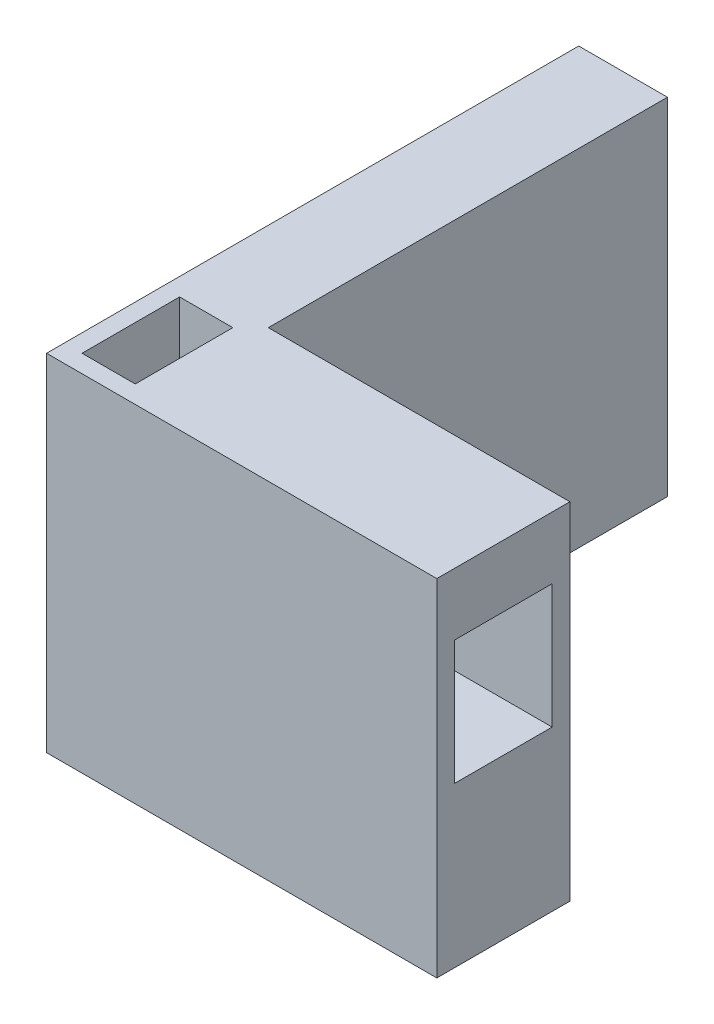
ISO-10303-21;
HEADER;
FILE_DESCRIPTION(('STEP AP214'),'2;1');
FILE_NAME('part.step','',(''),(''),'','','');
FILE_SCHEMA(('AUTOMOTIVE_DESIGN { 1 0 10303 214 1 1 1 1 }'));
ENDSEC;
DATA;
#1=APPLICATION_CONTEXT('core data for automotive mechanical design processes');
#2=APPLICATION_PROTOCOL_DEFINITION('international standard','automotive_design',2000,#1);
#3=PRODUCT_CONTEXT('',#1,'mechanical');
#4=PRODUCT('Part','Part','',(#3));
#5=PRODUCT_RELATED_PRODUCT_CATEGORY('part','',(#4));
#6=PRODUCT_DEFINITION_FORMATION('','',#4);
#7=PRODUCT_DEFINITION_CONTEXT('part definition',#1,'design');
#8=PRODUCT_DEFINITION('design','',#6,#7);
#9=PRODUCT_DEFINITION_SHAPE('','',#8);
#10=(LENGTH_UNIT() NAMED_UNIT(*) SI_UNIT(.MILLI.,.METRE.));
#11=(NAMED_UNIT(*) PLANE_ANGLE_UNIT() SI_UNIT($,.RADIAN.));
#12=(NAMED_UNIT(*) SI_UNIT($,.STERADIAN.) SOLID_ANGLE_UNIT());
#13=UNCERTAINTY_MEASURE_WITH_UNIT(LENGTH_MEASURE(1.E-05),#10,'distance_accuracy_value','');
#14=(GEOMETRIC_REPRESENTATION_CONTEXT(3) GLOBAL_UNCERTAINTY_ASSIGNED_CONTEXT((#13)) GLOBAL_UNIT_ASSIGNED_CONTEXT((#10,
#11,#12)) REPRESENTATION_CONTEXT('',''));
#15=CARTESIAN_POINT('',(0.,0.,0.));
#16=DIRECTION('',(0.,0.,1.));
#17=DIRECTION('',(1.,0.,0.));
#18=AXIS2_PLACEMENT_3D('',#15,#16,#17);
#19=CARTESIAN_POINT('',(0.,320.,0.));
#20=DIRECTION('',(0.,1.,0.));
#21=DIRECTION('',(0.,0.,1.));
#22=AXIS2_PLACEMENT_3D('',#19,#20,#21);
#23=PLANE('',#22);
#24=DIRECTION('',(0.,0.,-1.));
#25=VECTOR('',#24,1.);
#26=CARTESIAN_POINT('',(20.,320.,0.));
#27=LINE('',#26,#25);
#28=CARTESIAN_POINT('',(20.,320.,-20.));
#29=VERTEX_POINT('',#28);
#30=CARTESIAN_POINT('',(20.,320.,-130.));
#31=VERTEX_POINT('',#30);
#32=EDGE_CURVE('E279',#29,#31,#27,.T.);
#33=ORIENTED_EDGE('',*,*,#32,.F.);
#34=DIRECTION('',(1.,0.,0.));
#35=VECTOR('',#34,1.);
#36=CARTESIAN_POINT('',(0.,320.,-20.));
#37=LINE('',#36,#35);
#38=CARTESIAN_POINT('',(0.,320.,-20.));
#39=VERTEX_POINT('',#38);
#40=EDGE_CURVE('E313',#39,#29,#37,.T.);
#41=ORIENTED_EDGE('',*,*,#40,.F.);
#42=DIRECTION('',(0.,0.,1.));
#43=VECTOR('',#42,1.);
#44=CARTESIAN_POINT('',(0.,320.,0.));
#45=LINE('',#44,#43);
#46=CARTESIAN_POINT('',(0.,320.,-130.));
#47=VERTEX_POINT('',#46);
#48=EDGE_CURVE('E294',#47,#39,#45,.T.);
#49=ORIENTED_EDGE('',*,*,#48,.F.);
#50=DIRECTION('',(1.,0.,0.));
#51=VECTOR('',#50,1.);
#52=CARTESIAN_POINT('',(0.,320.,-130.));
#53=LINE('',#52,#51);
#54=EDGE_CURVE('E319',#47,#31,#53,.T.);
#55=ORIENTED_EDGE('',*,*,#54,.T.);
#56=EDGE_LOOP('',(#33,#41,#49,#55));
#57=FACE_BOUND('',#56,.T.);
#58=ADVANCED_FACE('F38',(#57),#23,.F.);
#59=CARTESIAN_POINT('',(0.,180.,0.));
#60=DIRECTION('',(0.,1.,0.));
#61=DIRECTION('',(0.,0.,1.));
#62=AXIS2_PLACEMENT_3D('',#59,#60,#61);
#63=PLANE('',#62);
#64=DIRECTION('',(1.,0.,0.));
#65=VECTOR('',#64,1.);
#66=CARTESIAN_POINT('',(0.,180.,-20.));
#67=LINE('',#66,#65);
#68=CARTESIAN_POINT('',(0.,180.,-20.));
#69=VERTEX_POINT('',#68);
#70=CARTESIAN_POINT('',(20.,180.,-20.));
#71=VERTEX_POINT('',#70);
#72=EDGE_CURVE('E329',#69,#71,#67,.T.);
#73=ORIENTED_EDGE('',*,*,#72,.T.);
#74=DIRECTION('',(0.,0.,-1.));
#75=VECTOR('',#74,1.);
#76=CARTESIAN_POINT('',(20.,180.,0.));
#77=LINE('',#76,#75);
#78=CARTESIAN_POINT('',(20.,180.,-130.));
#79=VERTEX_POINT('',#78);
#80=EDGE_CURVE('E11',#71,#79,#77,.T.);
#81=ORIENTED_EDGE('',*,*,#80,.T.);
#82=DIRECTION('',(1.,0.,0.));
#83=VECTOR('',#82,1.);
#84=CARTESIAN_POINT('',(0.,180.,-130.));
#85=LINE('',#84,#83);
#86=CARTESIAN_POINT('',(0.,180.,-130.));
#87=VERTEX_POINT('',#86);
#88=EDGE_CURVE('E324',#87,#79,#85,.T.);
#89=ORIENTED_EDGE('',*,*,#88,.F.);
#90=DIRECTION('',(0.,0.,1.));
#91=VECTOR('',#90,1.);
#92=CARTESIAN_POINT('',(0.,180.,0.));
#93=LINE('',#92,#91);
#94=EDGE_CURVE('E286',#87,#69,#93,.T.);
#95=ORIENTED_EDGE('',*,*,#94,.T.);
#96=EDGE_LOOP('',(#73,#81,#89,#95));
#97=FACE_BOUND('',#96,.T.);
#98=ADVANCED_FACE('F453',(#97),#63,.T.);
#99=CARTESIAN_POINT('',(0.,390.,-600.));
#100=DIRECTION('',(1.,0.,0.));
#101=DIRECTION('',(0.,0.,-1.));
#102=AXIS2_PLACEMENT_3D('',#99,#100,#101);
#103=PLANE('',#102);
#104=DIRECTION('',(0.,0.,1.));
#105=VECTOR('',#104,1.);
#106=CARTESIAN_POINT('',(0.,0.,-600.));
#107=LINE('',#106,#105);
#108=CARTESIAN_POINT('',(0.,0.,-600.));
#109=VERTEX_POINT('',#108);
#110=CARTESIAN_POINT('',(0.,0.,0.));
#111=VERTEX_POINT('',#110);
#112=EDGE_CURVE('E337',#109,#111,#107,.T.);
#113=ORIENTED_EDGE('',*,*,#112,.T.);
#114=DIRECTION('',(0.,-1.,0.));
#115=VECTOR('',#114,1.);
#116=CARTESIAN_POINT('',(0.,390.,0.));
#117=LINE('',#116,#115);
#118=CARTESIAN_POINT('',(0.,390.,0.));
#119=VERTEX_POINT('',#118);
#120=EDGE_CURVE('E395',#119,#111,#117,.T.);
#121=ORIENTED_EDGE('',*,*,#120,.F.);
#122=DIRECTION('',(0.,0.,1.));
#123=VECTOR('',#122,1.);
#124=CARTESIAN_POINT('',(0.,390.,-600.));
#125=LINE('',#124,#123);
#126=CARTESIAN_POINT('',(0.,390.,-600.));
#127=VERTEX_POINT('',#126);
#128=EDGE_CURVE('E338',#127,#119,#125,.T.);
#129=ORIENTED_EDGE('',*,*,#128,.F.);
#130=DIRECTION('',(0.,-1.,0.));
#131=VECTOR('',#130,1.);
#132=CARTESIAN_POINT('',(0.,390.,-600.));
#133=LINE('',#132,#131);
#134=EDGE_CURVE('E358',#127,#109,#133,.T.);
#135=ORIENTED_EDGE('',*,*,#134,.T.);
#136=EDGE_LOOP('',(#113,#121,#129,#135));
#137=FACE_BOUND('',#136,.T.);
#138=DIRECTION('',(0.,1.,0.));
#139=VECTOR('',#138,1.);
#140=CARTESIAN_POINT('',(0.,0.,-20.));
#141=LINE('',#140,#139);
#142=EDGE_CURVE('E283',#69,#39,#141,.T.);
#143=ORIENTED_EDGE('',*,*,#142,.F.);
#144=ORIENTED_EDGE('',*,*,#94,.F.);
#145=DIRECTION('',(0.,1.,0.));
#146=VECTOR('',#145,1.);
#147=CARTESIAN_POINT('',(0.,0.,-130.));
#148=LINE('',#147,#146);
#149=EDGE_CURVE('E290',#87,#47,#148,.T.);
#150=ORIENTED_EDGE('',*,*,#149,.T.);
#151=ORIENTED_EDGE('',*,*,#48,.T.);
#152=EDGE_LOOP('',(#143,#144,#150,#151));
#153=FACE_BOUND('',#152,.T.);
#154=ADVANCED_FACE('F40',(#137,#153),#103,.F.);
#155=CARTESIAN_POINT('',(440.,390.,0.));
#156=DIRECTION('',(-1.,0.,0.));
#157=DIRECTION('',(0.,0.,1.));
#158=AXIS2_PLACEMENT_3D('',#155,#156,#157);
#159=PLANE('',#158);
#160=DIRECTION('',(0.,0.,-1.));
#161=VECTOR('',#160,1.);
#162=CARTESIAN_POINT('',(440.,0.,0.));
#163=LINE('',#162,#161);
#164=CARTESIAN_POINT('',(440.,0.,0.));
#165=VERTEX_POINT('',#164);
#166=CARTESIAN_POINT('',(440.,0.,-150.));
#167=VERTEX_POINT('',#166);
#168=EDGE_CURVE('E365',#165,#167,#163,.T.);
#169=ORIENTED_EDGE('',*,*,#168,.T.);
#170=DIRECTION('',(0.,-1.,0.));
#171=VECTOR('',#170,1.);
#172=CARTESIAN_POINT('',(440.,390.,-150.));
#173=LINE('',#172,#171);
#174=CARTESIAN_POINT('',(440.,390.,-150.));
#175=VERTEX_POINT('',#174);
#176=EDGE_CURVE('E387',#175,#167,#173,.T.);
#177=ORIENTED_EDGE('',*,*,#176,.F.);
#178=DIRECTION('',(0.,0.,-1.));
#179=VECTOR('',#178,1.);
#180=CARTESIAN_POINT('',(440.,390.,0.));
#181=LINE('',#180,#179);
#182=CARTESIAN_POINT('',(440.,390.,0.));
#183=VERTEX_POINT('',#182);
#184=EDGE_CURVE('E346',#183,#175,#181,.T.);
#185=ORIENTED_EDGE('',*,*,#184,.F.);
#186=DIRECTION('',(0.,-1.,0.));
#187=VECTOR('',#186,1.);
#188=CARTESIAN_POINT('',(440.,390.,0.));
#189=LINE('',#188,#187);
#190=EDGE_CURVE('E391',#183,#165,#189,.T.);
#191=ORIENTED_EDGE('',*,*,#190,.T.);
#192=EDGE_LOOP('',(#169,#177,#185,#191));
#193=FACE_BOUND('',#192,.T.);
#194=DIRECTION('',(0.,1.,0.));
#195=VECTOR('',#194,1.);
#196=CARTESIAN_POINT('',(440.,0.,-20.));
#197=LINE('',#196,#195);
#198=CARTESIAN_POINT('',(440.,180.,-20.));
#199=VERTEX_POINT('',#198);
#200=CARTESIAN_POINT('',(440.,320.,-20.));
#201=VERTEX_POINT('',#200);
#202=EDGE_CURVE('E282',#199,#201,#197,.T.);
#203=ORIENTED_EDGE('',*,*,#202,.T.);
#204=DIRECTION('',(0.,0.,1.));
#205=VECTOR('',#204,1.);
#206=CARTESIAN_POINT('',(440.,320.,0.));
#207=LINE('',#206,#205);
#208=CARTESIAN_POINT('',(440.,320.,-130.));
#209=VERTEX_POINT('',#208);
#210=EDGE_CURVE('E287',#209,#201,#207,.T.);
#211=ORIENTED_EDGE('',*,*,#210,.F.);
#212=DIRECTION('',(0.,1.,0.));
#213=VECTOR('',#212,1.);
#214=CARTESIAN_POINT('',(440.,0.,-130.));
#215=LINE('',#214,#213);
#216=CARTESIAN_POINT('',(440.,180.,-130.));
#217=VERTEX_POINT('',#216);
#218=EDGE_CURVE('E306',#217,#209,#215,.T.);
#219=ORIENTED_EDGE('',*,*,#218,.F.);
#220=DIRECTION('',(0.,0.,1.));
#221=VECTOR('',#220,1.);
#222=CARTESIAN_POINT('',(440.,180.,0.));
#223=LINE('',#222,#221);
#224=EDGE_CURVE('E302',#217,#199,#223,.T.);
#225=ORIENTED_EDGE('',*,*,#224,.T.);
#226=EDGE_LOOP('',(#203,#211,#219,#225));
#227=FACE_BOUND('',#226,.T.);
#228=ADVANCED_FACE('F480',(#193,#227),#159,.F.);
#229=CARTESIAN_POINT('',(0.,390.,0.));
#230=DIRECTION('',(0.,0.,-1.));
#231=DIRECTION('',(-1.,0.,0.));
#232=AXIS2_PLACEMENT_3D('',#229,#230,#231);
#233=PLANE('',#232);
#234=DIRECTION('',(1.,0.,0.));
#235=VECTOR('',#234,1.);
#236=CARTESIAN_POINT('',(0.,0.,0.));
#237=LINE('',#236,#235);
#238=EDGE_CURVE('E362',#111,#165,#237,.T.);
#239=ORIENTED_EDGE('',*,*,#238,.T.);
#240=ORIENTED_EDGE('',*,*,#190,.F.);
#241=DIRECTION('',(1.,0.,0.));
#242=VECTOR('',#241,1.);
#243=CARTESIAN_POINT('',(0.,390.,0.));
#244=LINE('',#243,#242);
#245=EDGE_CURVE('E342',#119,#183,#244,.T.);
#246=ORIENTED_EDGE('',*,*,#245,.F.);
#247=ORIENTED_EDGE('',*,*,#120,.T.);
#248=EDGE_LOOP('',(#239,#240,#246,#247));
#249=FACE_BOUND('',#248,.T.);
#250=ADVANCED_FACE('F515',(#249),#233,.F.);
#251=CARTESIAN_POINT('',(440.,390.,-150.));
#252=DIRECTION('',(0.,0.,1.));
#253=DIRECTION('',(1.,0.,0.));
#254=AXIS2_PLACEMENT_3D('',#251,#252,#253);
#255=PLANE('',#254);
#256=CARTESIAN_POINT('',(190.,250.,-150.));
#257=DIRECTION('',(0.,0.,-1.));
#258=DIRECTION('',(-1.,0.,0.));
#259=AXIS2_PLACEMENT_3D('',#256,#257,#258);
#260=CIRCLE('',#259,30.0000000000001);
#261=CARTESIAN_POINT('',(160.,250.,-150.));
#262=VERTEX_POINT('',#261);
#263=EDGE_CURVE('E333',#262,#262,#260,.T.);
#264=ORIENTED_EDGE('',*,*,#263,.F.);
#265=EDGE_LOOP('',(#264));
#266=FACE_BOUND('',#265,.T.);
#267=DIRECTION('',(-1.,0.,0.));
#268=VECTOR('',#267,1.);
#269=CARTESIAN_POINT('',(440.,0.,-150.));
#270=LINE('',#269,#268);
#271=CARTESIAN_POINT('',(100.,0.,-150.));
#272=VERTEX_POINT('',#271);
#273=EDGE_CURVE('E368',#167,#272,#270,.T.);
#274=ORIENTED_EDGE('',*,*,#273,.T.);
#275=DIRECTION('',(0.,-1.,0.));
#276=VECTOR('',#275,1.);
#277=CARTESIAN_POINT('',(100.,390.,-150.));
#278=LINE('',#277,#276);
#279=CARTESIAN_POINT('',(100.,390.,-150.));
#280=VERTEX_POINT('',#279);
#281=EDGE_CURVE('E383',#280,#272,#278,.T.);
#282=ORIENTED_EDGE('',*,*,#281,.F.);
#283=DIRECTION('',(-1.,0.,0.));
#284=VECTOR('',#283,1.);
#285=CARTESIAN_POINT('',(440.,390.,-150.));
#286=LINE('',#285,#284);
#287=EDGE_CURVE('E349',#175,#280,#286,.T.);
#288=ORIENTED_EDGE('',*,*,#287,.F.);
#289=ORIENTED_EDGE('',*,*,#176,.T.);
#290=EDGE_LOOP('',(#274,#282,#288,#289));
#291=FACE_BOUND('',#290,.T.);
#292=ADVANCED_FACE('F525',(#266,#291),#255,.F.);
#293=CARTESIAN_POINT('',(100.,390.,-150.));
#294=DIRECTION('',(-1.,0.,0.));
#295=DIRECTION('',(0.,0.,1.));
#296=AXIS2_PLACEMENT_3D('',#293,#294,#295);
#297=PLANE('',#296);
#298=DIRECTION('',(0.,0.,-1.));
#299=VECTOR('',#298,1.);
#300=CARTESIAN_POINT('',(100.,0.,-150.));
#301=LINE('',#300,#299);
#302=CARTESIAN_POINT('',(100.,0.,-600.));
#303=VERTEX_POINT('',#302);
#304=EDGE_CURVE('E371',#272,#303,#301,.T.);
#305=ORIENTED_EDGE('',*,*,#304,.T.);
#306=DIRECTION('',(0.,-1.,0.));
#307=VECTOR('',#306,1.);
#308=CARTESIAN_POINT('',(100.,390.,-600.));
#309=LINE('',#308,#307);
#310=CARTESIAN_POINT('',(100.,390.,-600.));
#311=VERTEX_POINT('',#310);
#312=EDGE_CURVE('E379',#311,#303,#309,.T.);
#313=ORIENTED_EDGE('',*,*,#312,.F.);
#314=DIRECTION('',(0.,0.,-1.));
#315=VECTOR('',#314,1.);
#316=CARTESIAN_POINT('',(100.,390.,-150.));
#317=LINE('',#316,#315);
#318=EDGE_CURVE('E352',#280,#311,#317,.T.);
#319=ORIENTED_EDGE('',*,*,#318,.F.);
#320=ORIENTED_EDGE('',*,*,#281,.T.);
#321=EDGE_LOOP('',(#305,#313,#319,#320));
#322=FACE_BOUND('',#321,.T.);
#323=ADVANCED_FACE('F529',(#322),#297,.F.);
#324=CARTESIAN_POINT('',(100.,390.,-600.));
#325=DIRECTION('',(0.,0.,1.));
#326=DIRECTION('',(1.,0.,0.));
#327=AXIS2_PLACEMENT_3D('',#324,#325,#326);
#328=PLANE('',#327);
#329=DIRECTION('',(1.,0.,0.));
#330=VECTOR('',#329,1.);
#331=CARTESIAN_POINT('',(80.,280.,-600.));
#332=LINE('',#331,#330);
#333=CARTESIAN_POINT('',(20.,280.,-600.));
#334=VERTEX_POINT('',#333);
#335=CARTESIAN_POINT('',(80.,280.,-600.));
#336=VERTEX_POINT('',#335);
#337=EDGE_CURVE('E201',#334,#336,#332,.T.);
#338=ORIENTED_EDGE('',*,*,#337,.F.);
#339=DIRECTION('',(0.,1.,0.));
#340=VECTOR('',#339,1.);
#341=CARTESIAN_POINT('',(20.,280.,-600.));
#342=LINE('',#341,#340);
#343=CARTESIAN_POINT('',(20.,220.,-600.));
#344=VERTEX_POINT('',#343);
#345=EDGE_CURVE('E54',#344,#334,#342,.T.);
#346=ORIENTED_EDGE('',*,*,#345,.F.);
#347=DIRECTION('',(-1.,0.,0.));
#348=VECTOR('',#347,1.);
#349=CARTESIAN_POINT('',(80.,220.,-600.));
#350=LINE('',#349,#348);
#351=CARTESIAN_POINT('',(80.,220.,-600.));
#352=VERTEX_POINT('',#351);
#353=EDGE_CURVE('E209',#352,#344,#350,.T.);
#354=ORIENTED_EDGE('',*,*,#353,.F.);
#355=DIRECTION('',(0.,-1.,0.));
#356=VECTOR('',#355,1.);
#357=CARTESIAN_POINT('',(80.,280.,-600.));
#358=LINE('',#357,#356);
#359=EDGE_CURVE('E191',#336,#352,#358,.T.);
#360=ORIENTED_EDGE('',*,*,#359,.F.);
#361=EDGE_LOOP('',(#338,#346,#354,#360));
#362=FACE_BOUND('',#361,.T.);
#363=DIRECTION('',(-1.,0.,0.));
#364=VECTOR('',#363,1.);
#365=CARTESIAN_POINT('',(100.,0.,-600.));
#366=LINE('',#365,#364);
#367=EDGE_CURVE('E343',#303,#109,#366,.T.);
#368=ORIENTED_EDGE('',*,*,#367,.T.);
#369=ORIENTED_EDGE('',*,*,#134,.F.);
#370=DIRECTION('',(-1.,0.,0.));
#371=VECTOR('',#370,1.);
#372=CARTESIAN_POINT('',(100.,390.,-600.));
#373=LINE('',#372,#371);
#374=EDGE_CURVE('E355',#311,#127,#373,.T.);
#375=ORIENTED_EDGE('',*,*,#374,.F.);
#376=ORIENTED_EDGE('',*,*,#312,.T.);
#377=EDGE_LOOP('',(#368,#369,#375,#376));
#378=FACE_BOUND('',#377,.T.);
#379=ADVANCED_FACE('F206',(#362,#378),#328,.F.);
#380=CARTESIAN_POINT('',(0.,390.,0.));
#381=DIRECTION('',(0.,1.,0.));
#382=DIRECTION('',(0.,0.,1.));
#383=AXIS2_PLACEMENT_3D('',#380,#381,#382);
#384=PLANE('',#383);
#385=DIRECTION('',(-1.,0.,0.));
#386=VECTOR('',#385,1.);
#387=CARTESIAN_POINT('',(0.,390.,-20.));
#388=LINE('',#387,#386);
#389=CARTESIAN_POINT('',(79.9999999999999,390.,-20.));
#390=VERTEX_POINT('',#389);
#391=CARTESIAN_POINT('',(20.,390.,-20.));
#392=VERTEX_POINT('',#391);
#393=EDGE_CURVE('E244',#390,#392,#388,.T.);
#394=ORIENTED_EDGE('',*,*,#393,.T.);
#395=DIRECTION('',(0.,0.,1.));
#396=VECTOR('',#395,1.);
#397=CARTESIAN_POINT('',(20.,390.,0.));
#398=LINE('',#397,#396);
#399=CARTESIAN_POINT('',(20.,390.,-130.));
#400=VERTEX_POINT('',#399);
#401=EDGE_CURVE('E249',#400,#392,#398,.T.);
#402=ORIENTED_EDGE('',*,*,#401,.F.);
#403=DIRECTION('',(-1.,0.,0.));
#404=VECTOR('',#403,1.);
#405=CARTESIAN_POINT('',(0.,390.,-130.));
#406=LINE('',#405,#404);
#407=CARTESIAN_POINT('',(79.9999999999999,390.,-130.));
#408=VERTEX_POINT('',#407);
#409=EDGE_CURVE('E226',#408,#400,#406,.T.);
#410=ORIENTED_EDGE('',*,*,#409,.F.);
#411=DIRECTION('',(0.,0.,1.));
#412=VECTOR('',#411,1.);
#413=CARTESIAN_POINT('',(79.9999999999999,390.,0.));
#414=LINE('',#413,#412);
#415=EDGE_CURVE('E232',#408,#390,#414,.T.);
#416=ORIENTED_EDGE('',*,*,#415,.T.);
#417=EDGE_LOOP('',(#394,#402,#410,#416));
#418=FACE_BOUND('',#417,.T.);
#419=ORIENTED_EDGE('',*,*,#128,.T.);
#420=ORIENTED_EDGE('',*,*,#245,.T.);
#421=ORIENTED_EDGE('',*,*,#184,.T.);
#422=ORIENTED_EDGE('',*,*,#287,.T.);
#423=ORIENTED_EDGE('',*,*,#318,.T.);
#424=ORIENTED_EDGE('',*,*,#374,.T.);
#425=EDGE_LOOP('',(#419,#420,#421,#422,#423,#424));
#426=FACE_BOUND('',#425,.T.);
#427=ADVANCED_FACE('F502',(#418,#426),#384,.T.);
#428=CARTESIAN_POINT('',(0.,0.,0.));
#429=DIRECTION('',(0.,1.,0.));
#430=DIRECTION('',(0.,0.,1.));
#431=AXIS2_PLACEMENT_3D('',#428,#429,#430);
#432=PLANE('',#431);
#433=DIRECTION('',(0.,0.,1.));
#434=VECTOR('',#433,1.);
#435=CARTESIAN_POINT('',(20.,0.,0.));
#436=LINE('',#435,#434);
#437=CARTESIAN_POINT('',(20.,0.,-130.));
#438=VERTEX_POINT('',#437);
#439=CARTESIAN_POINT('',(20.,0.,-20.));
#440=VERTEX_POINT('',#439);
#441=EDGE_CURVE('E234',#438,#440,#436,.T.);
#442=ORIENTED_EDGE('',*,*,#441,.T.);
#443=DIRECTION('',(-1.,0.,0.));
#444=VECTOR('',#443,1.);
#445=CARTESIAN_POINT('',(0.,0.,-20.));
#446=LINE('',#445,#444);
#447=CARTESIAN_POINT('',(79.9999999999999,0.,-20.));
#448=VERTEX_POINT('',#447);
#449=EDGE_CURVE('E240',#448,#440,#446,.T.);
#450=ORIENTED_EDGE('',*,*,#449,.F.);
#451=DIRECTION('',(0.,0.,1.));
#452=VECTOR('',#451,1.);
#453=CARTESIAN_POINT('',(79.9999999999999,0.,0.));
#454=LINE('',#453,#452);
#455=CARTESIAN_POINT('',(79.9999999999999,0.,-130.));
#456=VERTEX_POINT('',#455);
#457=EDGE_CURVE('E245',#456,#448,#454,.T.);
#458=ORIENTED_EDGE('',*,*,#457,.F.);
#459=DIRECTION('',(-1.,0.,0.));
#460=VECTOR('',#459,1.);
#461=CARTESIAN_POINT('',(0.,0.,-130.));
#462=LINE('',#461,#460);
#463=EDGE_CURVE('E228',#456,#438,#462,.T.);
#464=ORIENTED_EDGE('',*,*,#463,.T.);
#465=EDGE_LOOP('',(#442,#450,#458,#464));
#466=FACE_BOUND('',#465,.T.);
#467=ORIENTED_EDGE('',*,*,#112,.F.);
#468=ORIENTED_EDGE('',*,*,#367,.F.);
#469=ORIENTED_EDGE('',*,*,#304,.F.);
#470=ORIENTED_EDGE('',*,*,#273,.F.);
#471=ORIENTED_EDGE('',*,*,#168,.F.);
#472=ORIENTED_EDGE('',*,*,#238,.F.);
#473=EDGE_LOOP('',(#467,#468,#469,#470,#471,#472));
#474=FACE_BOUND('',#473,.T.);
#475=ADVANCED_FACE('F484',(#466,#474),#432,.F.);
#476=CARTESIAN_POINT('',(190.,250.,-30.));
#477=DIRECTION('',(0.,0.,-1.));
#478=DIRECTION('',(-1.,0.,0.));
#479=AXIS2_PLACEMENT_3D('',#476,#477,#478);
#480=CYLINDRICAL_SURFACE('',#479,30.0000000000001);
#481=CARTESIAN_POINT('',(190.,250.,-130.));
#482=DIRECTION('',(0.,0.,-1.));
#483=DIRECTION('',(-1.,0.,0.));
#484=AXIS2_PLACEMENT_3D('',#481,#482,#483);
#485=CIRCLE('',#484,30.0000000000001);
#486=CARTESIAN_POINT('',(160.,250.,-130.));
#487=VERTEX_POINT('',#486);
#488=EDGE_CURVE('E317',#487,#487,#485,.F.);
#489=ORIENTED_EDGE('',*,*,#488,.T.);
#490=EDGE_LOOP('',(#489));
#491=FACE_BOUND('',#490,.T.);
#492=ORIENTED_EDGE('',*,*,#263,.T.);
#493=EDGE_LOOP('',(#492));
#494=FACE_BOUND('',#493,.T.);
#495=ADVANCED_FACE('F532',(#491,#494),#480,.F.);
#496=CARTESIAN_POINT('',(0.,0.,-130.));
#497=DIRECTION('',(0.,0.,-1.));
#498=DIRECTION('',(-1.,0.,0.));
#499=AXIS2_PLACEMENT_3D('',#496,#497,#498);
#500=PLANE('',#499);
#501=DIRECTION('',(1.,0.,0.));
#502=VECTOR('',#501,1.);
#503=CARTESIAN_POINT('',(80.,220.,-130.));
#504=LINE('',#503,#502);
#505=CARTESIAN_POINT('',(20.,220.,-130.));
#506=VERTEX_POINT('',#505);
#507=CARTESIAN_POINT('',(80.,220.,-130.));
#508=VERTEX_POINT('',#507);
#509=EDGE_CURVE('E427',#506,#508,#504,.T.);
#510=ORIENTED_EDGE('',*,*,#509,.F.);
#511=DIRECTION('',(0.,-1.,0.));
#512=VECTOR('',#511,1.);
#513=CARTESIAN_POINT('',(20.,280.,-130.));
#514=LINE('',#513,#512);
#515=CARTESIAN_POINT('',(20.,280.,-130.));
#516=VERTEX_POINT('',#515);
#517=EDGE_CURVE('E227',#516,#506,#514,.T.);
#518=ORIENTED_EDGE('',*,*,#517,.F.);
#519=DIRECTION('',(-1.,0.,0.));
#520=VECTOR('',#519,1.);
#521=CARTESIAN_POINT('',(80.,280.,-130.));
#522=LINE('',#521,#520);
#523=CARTESIAN_POINT('',(80.,280.,-130.));
#524=VERTEX_POINT('',#523);
#525=EDGE_CURVE('E223',#524,#516,#522,.T.);
#526=ORIENTED_EDGE('',*,*,#525,.F.);
#527=DIRECTION('',(0.,1.,0.));
#528=VECTOR('',#527,1.);
#529=CARTESIAN_POINT('',(80.,280.,-130.));
#530=LINE('',#529,#528);
#531=EDGE_CURVE('E194',#508,#524,#530,.T.);
#532=ORIENTED_EDGE('',*,*,#531,.F.);
#533=EDGE_LOOP('',(#510,#518,#526,#532));
#534=FACE_BOUND('',#533,.T.);
#535=CARTESIAN_POINT('',(79.9999999999999,320.,-130.));
#536=VERTEX_POINT('',#535);
#537=EDGE_CURVE('E323',#536,#209,#53,.T.);
#538=ORIENTED_EDGE('',*,*,#537,.F.);
#539=DIRECTION('',(0.,-1.,0.));
#540=VECTOR('',#539,1.);
#541=CARTESIAN_POINT('',(79.9999999999999,515.299640861417,-130.));
#542=LINE('',#541,#540);
#543=EDGE_CURVE('E233',#408,#536,#542,.T.);
#544=ORIENTED_EDGE('',*,*,#543,.F.);
#545=ORIENTED_EDGE('',*,*,#409,.T.);
#546=DIRECTION('',(0.,-1.,0.));
#547=VECTOR('',#546,1.);
#548=CARTESIAN_POINT('',(20.,515.299640861417,-130.));
#549=LINE('',#548,#547);
#550=EDGE_CURVE('E239',#400,#31,#549,.T.);
#551=ORIENTED_EDGE('',*,*,#550,.T.);
#552=ORIENTED_EDGE('',*,*,#54,.F.);
#553=ORIENTED_EDGE('',*,*,#149,.F.);
#554=ORIENTED_EDGE('',*,*,#88,.T.);
#555=EDGE_CURVE('E267',#79,#438,#549,.T.);
#556=ORIENTED_EDGE('',*,*,#555,.T.);
#557=ORIENTED_EDGE('',*,*,#463,.F.);
#558=CARTESIAN_POINT('',(79.9999999999999,180.,-130.));
#559=VERTEX_POINT('',#558);
#560=EDGE_CURVE('E238',#559,#456,#542,.T.);
#561=ORIENTED_EDGE('',*,*,#560,.F.);
#562=EDGE_CURVE('E328',#559,#217,#85,.T.);
#563=ORIENTED_EDGE('',*,*,#562,.T.);
#564=ORIENTED_EDGE('',*,*,#218,.T.);
#565=EDGE_LOOP('',(#538,#544,#545,#551,#552,#553,#554,#556,#557,#561,#563,#564));
#566=FACE_BOUND('',#565,.T.);
#567=ORIENTED_EDGE('',*,*,#488,.F.);
#568=EDGE_LOOP('',(#567));
#569=FACE_BOUND('',#568,.T.);
#570=ADVANCED_FACE('F413',(#534,#566,#569),#500,.F.);
#571=CARTESIAN_POINT('',(0.,0.,-20.));
#572=DIRECTION('',(0.,0.,-1.));
#573=DIRECTION('',(-1.,0.,0.));
#574=AXIS2_PLACEMENT_3D('',#571,#572,#573);
#575=PLANE('',#574);
#576=CARTESIAN_POINT('',(79.9999999999999,180.,-20.));
#577=VERTEX_POINT('',#576);
#578=EDGE_CURVE('E298',#577,#199,#67,.T.);
#579=ORIENTED_EDGE('',*,*,#578,.F.);
#580=DIRECTION('',(0.,-1.,0.));
#581=VECTOR('',#580,1.);
#582=CARTESIAN_POINT('',(79.9999999999999,515.299640861417,-20.));
#583=LINE('',#582,#581);
#584=EDGE_CURVE('E257',#577,#448,#583,.T.);
#585=ORIENTED_EDGE('',*,*,#584,.T.);
#586=ORIENTED_EDGE('',*,*,#449,.T.);
#587=DIRECTION('',(0.,-1.,0.));
#588=VECTOR('',#587,1.);
#589=CARTESIAN_POINT('',(20.,515.299640861417,-20.));
#590=LINE('',#589,#588);
#591=EDGE_CURVE('E253',#71,#440,#590,.T.);
#592=ORIENTED_EDGE('',*,*,#591,.F.);
#593=ORIENTED_EDGE('',*,*,#72,.F.);
#594=ORIENTED_EDGE('',*,*,#142,.T.);
#595=ORIENTED_EDGE('',*,*,#40,.T.);
#596=EDGE_CURVE('E268',#392,#29,#590,.T.);
#597=ORIENTED_EDGE('',*,*,#596,.F.);
#598=ORIENTED_EDGE('',*,*,#393,.F.);
#599=CARTESIAN_POINT('',(79.9999999999999,320.,-20.));
#600=VERTEX_POINT('',#599);
#601=EDGE_CURVE('E271',#390,#600,#583,.T.);
#602=ORIENTED_EDGE('',*,*,#601,.T.);
#603=EDGE_CURVE('E318',#600,#201,#37,.T.);
#604=ORIENTED_EDGE('',*,*,#603,.T.);
#605=ORIENTED_EDGE('',*,*,#202,.F.);
#606=EDGE_LOOP('',(#579,#585,#586,#592,#593,#594,#595,#597,#598,#602,#604,#605));
#607=FACE_BOUND('',#606,.T.);
#608=ADVANCED_FACE('F466',(#607),#575,.T.);
#609=ORIENTED_EDGE('',*,*,#603,.F.);
#610=DIRECTION('',(0.,0.,-1.));
#611=VECTOR('',#610,1.);
#612=CARTESIAN_POINT('',(79.9999999999999,320.,0.));
#613=LINE('',#612,#611);
#614=EDGE_CURVE('E275',#600,#536,#613,.T.);
#615=ORIENTED_EDGE('',*,*,#614,.T.);
#616=ORIENTED_EDGE('',*,*,#537,.T.);
#617=ORIENTED_EDGE('',*,*,#210,.T.);
#618=EDGE_LOOP('',(#609,#615,#616,#617));
#619=FACE_BOUND('',#618,.T.);
#620=ADVANCED_FACE('F456',(#619),#23,.F.);
#621=DIRECTION('',(0.,0.,-1.));
#622=VECTOR('',#621,1.);
#623=CARTESIAN_POINT('',(79.9999999999999,180.,0.));
#624=LINE('',#623,#622);
#625=EDGE_CURVE('E47',#577,#559,#624,.T.);
#626=ORIENTED_EDGE('',*,*,#625,.F.);
#627=ORIENTED_EDGE('',*,*,#578,.T.);
#628=ORIENTED_EDGE('',*,*,#224,.F.);
#629=ORIENTED_EDGE('',*,*,#562,.F.);
#630=EDGE_LOOP('',(#626,#627,#628,#629));
#631=FACE_BOUND('',#630,.T.);
#632=ADVANCED_FACE('F417',(#631),#63,.T.);
#633=CARTESIAN_POINT('',(79.9999999999999,515.299640861417,0.));
#634=DIRECTION('',(1.,0.,0.));
#635=DIRECTION('',(0.,0.,-1.));
#636=AXIS2_PLACEMENT_3D('',#633,#634,#635);
#637=PLANE('',#636);
#638=ORIENTED_EDGE('',*,*,#625,.T.);
#639=ORIENTED_EDGE('',*,*,#560,.T.);
#640=ORIENTED_EDGE('',*,*,#457,.T.);
#641=ORIENTED_EDGE('',*,*,#584,.F.);
#642=EDGE_LOOP('',(#638,#639,#640,#641));
#643=FACE_BOUND('',#642,.T.);
#644=ADVANCED_FACE('F406',(#643),#637,.F.);
#645=CARTESIAN_POINT('',(20.,515.299640861417,0.));
#646=DIRECTION('',(1.,0.,0.));
#647=DIRECTION('',(0.,0.,-1.));
#648=AXIS2_PLACEMENT_3D('',#645,#646,#647);
#649=PLANE('',#648);
#650=ORIENTED_EDGE('',*,*,#591,.T.);
#651=ORIENTED_EDGE('',*,*,#441,.F.);
#652=ORIENTED_EDGE('',*,*,#555,.F.);
#653=ORIENTED_EDGE('',*,*,#80,.F.);
#654=EDGE_LOOP('',(#650,#651,#652,#653));
#655=FACE_BOUND('',#654,.T.);
#656=ADVANCED_FACE('F488',(#655),#649,.T.);
#657=ORIENTED_EDGE('',*,*,#32,.T.);
#658=ORIENTED_EDGE('',*,*,#550,.F.);
#659=ORIENTED_EDGE('',*,*,#401,.T.);
#660=ORIENTED_EDGE('',*,*,#596,.T.);
#661=EDGE_LOOP('',(#657,#658,#659,#660));
#662=FACE_BOUND('',#661,.T.);
#663=ADVANCED_FACE('F448',(#662),#649,.T.);
#664=ORIENTED_EDGE('',*,*,#601,.F.);
#665=ORIENTED_EDGE('',*,*,#415,.F.);
#666=ORIENTED_EDGE('',*,*,#543,.T.);
#667=ORIENTED_EDGE('',*,*,#614,.F.);
#668=EDGE_LOOP('',(#664,#665,#666,#667));
#669=FACE_BOUND('',#668,.T.);
#670=ADVANCED_FACE('F441',(#669),#637,.F.);
#671=CARTESIAN_POINT('',(20.,280.,-45.1471862576144));
#672=DIRECTION('',(-1.,0.,0.));
#673=DIRECTION('',(0.,-1.,0.));
#674=AXIS2_PLACEMENT_3D('',#671,#672,#673);
#675=PLANE('',#674);
#676=ORIENTED_EDGE('',*,*,#517,.T.);
#677=DIRECTION('',(0.,0.,-1.));
#678=VECTOR('',#677,1.);
#679=CARTESIAN_POINT('',(20.,220.,-45.1471862576144));
#680=LINE('',#679,#678);
#681=EDGE_CURVE('E216',#506,#344,#680,.T.);
#682=ORIENTED_EDGE('',*,*,#681,.T.);
#683=ORIENTED_EDGE('',*,*,#345,.T.);
#684=DIRECTION('',(0.,0.,-1.));
#685=VECTOR('',#684,1.);
#686=CARTESIAN_POINT('',(20.,280.,-45.1471862576144));
#687=LINE('',#686,#685);
#688=EDGE_CURVE('E198',#516,#334,#687,.T.);
#689=ORIENTED_EDGE('',*,*,#688,.F.);
#690=EDGE_LOOP('',(#676,#682,#683,#689));
#691=FACE_BOUND('',#690,.T.);
#692=ADVANCED_FACE('F439',(#691),#675,.F.);
#693=CARTESIAN_POINT('',(80.,220.,-45.1471862576144));
#694=DIRECTION('',(0.,-1.,0.));
#695=DIRECTION('',(0.,0.,-1.));
#696=AXIS2_PLACEMENT_3D('',#693,#694,#695);
#697=PLANE('',#696);
#698=ORIENTED_EDGE('',*,*,#509,.T.);
#699=DIRECTION('',(0.,0.,-1.));
#700=VECTOR('',#699,1.);
#701=CARTESIAN_POINT('',(80.,220.,-45.1471862576144));
#702=LINE('',#701,#700);
#703=EDGE_CURVE('E197',#508,#352,#702,.T.);
#704=ORIENTED_EDGE('',*,*,#703,.T.);
#705=ORIENTED_EDGE('',*,*,#353,.T.);
#706=ORIENTED_EDGE('',*,*,#681,.F.);
#707=EDGE_LOOP('',(#698,#704,#705,#706));
#708=FACE_BOUND('',#707,.T.);
#709=ADVANCED_FACE('F436',(#708),#697,.F.);
#710=CARTESIAN_POINT('',(80.,280.,-45.1471862576144));
#711=DIRECTION('',(1.,0.,0.));
#712=DIRECTION('',(0.,1.,0.));
#713=AXIS2_PLACEMENT_3D('',#710,#711,#712);
#714=PLANE('',#713);
#715=ORIENTED_EDGE('',*,*,#531,.T.);
#716=DIRECTION('',(0.,0.,-1.));
#717=VECTOR('',#716,1.);
#718=CARTESIAN_POINT('',(80.,280.,-45.1471862576144));
#719=LINE('',#718,#717);
#720=EDGE_CURVE('E62',#524,#336,#719,.T.);
#721=ORIENTED_EDGE('',*,*,#720,.T.);
#722=ORIENTED_EDGE('',*,*,#359,.T.);
#723=ORIENTED_EDGE('',*,*,#703,.F.);
#724=EDGE_LOOP('',(#715,#721,#722,#723));
#725=FACE_BOUND('',#724,.T.);
#726=ADVANCED_FACE('F188',(#725),#714,.F.);
#727=CARTESIAN_POINT('',(80.,280.,-45.1471862576144));
#728=DIRECTION('',(0.,1.,0.));
#729=DIRECTION('',(0.,0.,1.));
#730=AXIS2_PLACEMENT_3D('',#727,#728,#729);
#731=PLANE('',#730);
#732=ORIENTED_EDGE('',*,*,#525,.T.);
#733=ORIENTED_EDGE('',*,*,#688,.T.);
#734=ORIENTED_EDGE('',*,*,#337,.T.);
#735=ORIENTED_EDGE('',*,*,#720,.F.);
#736=EDGE_LOOP('',(#732,#733,#734,#735));
#737=FACE_BOUND('',#736,.T.);
#738=ADVANCED_FACE('F202',(#737),#731,.F.);
#739=CLOSED_SHELL('',(#58,#98,#154,#228,#250,#292,#323,#379,#427,#475,#495,#570,#608,#620,#632,
#644,#656,#663,#670,#692,#709,#726,#738));
#740=MANIFOLD_SOLID_BREP('B2',#739);
#741=ADVANCED_BREP_SHAPE_REPRESENTATION('',(#18,#740),#14);
#742=SHAPE_DEFINITION_REPRESENTATION(#9,#741);
ENDSEC;
END-ISO-10303-21;
